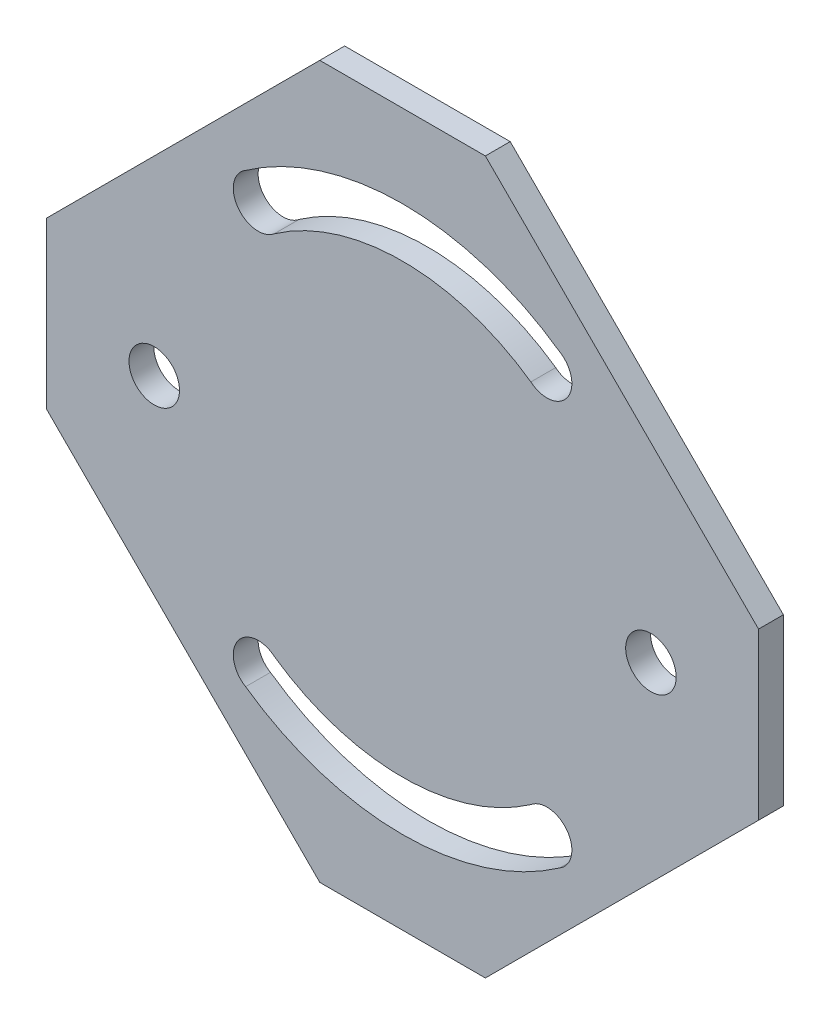
ISO-10303-21;
HEADER;
FILE_DESCRIPTION(('STEP AP214'),'2;1');
FILE_NAME('part.step','',(''),(''),'','','');
FILE_SCHEMA(('AUTOMOTIVE_DESIGN { 1 0 10303 214 1 1 1 1 }'));
ENDSEC;
DATA;
#1=APPLICATION_CONTEXT('core data for automotive mechanical design processes');
#2=APPLICATION_PROTOCOL_DEFINITION('international standard','automotive_design',2000,#1);
#3=PRODUCT_CONTEXT('',#1,'mechanical');
#4=PRODUCT('Part','Part','',(#3));
#5=PRODUCT_RELATED_PRODUCT_CATEGORY('part','',(#4));
#6=PRODUCT_DEFINITION_FORMATION('','',#4);
#7=PRODUCT_DEFINITION_CONTEXT('part definition',#1,'design');
#8=PRODUCT_DEFINITION('design','',#6,#7);
#9=PRODUCT_DEFINITION_SHAPE('','',#8);
#10=(LENGTH_UNIT() NAMED_UNIT(*) SI_UNIT(.MILLI.,.METRE.));
#11=(NAMED_UNIT(*) PLANE_ANGLE_UNIT() SI_UNIT($,.RADIAN.));
#12=(NAMED_UNIT(*) SI_UNIT($,.STERADIAN.) SOLID_ANGLE_UNIT());
#13=UNCERTAINTY_MEASURE_WITH_UNIT(LENGTH_MEASURE(1.E-05),#10,'distance_accuracy_value','');
#14=(GEOMETRIC_REPRESENTATION_CONTEXT(3) GLOBAL_UNCERTAINTY_ASSIGNED_CONTEXT((#13)) GLOBAL_UNIT_ASSIGNED_CONTEXT((#10,
#11,#12)) REPRESENTATION_CONTEXT('',''));
#15=CARTESIAN_POINT('',(0.,0.,0.));
#16=DIRECTION('',(0.,0.,1.));
#17=DIRECTION('',(1.,0.,0.));
#18=AXIS2_PLACEMENT_3D('',#15,#16,#17);
#19=CARTESIAN_POINT('',(53.0388822873707,-0.445460797800119,3.));
#20=DIRECTION('',(0.,0.,-1.));
#21=DIRECTION('',(-1.,0.,0.));
#22=AXIS2_PLACEMENT_3D('',#19,#20,#21);
#23=PLANE('',#22);
#24=CARTESIAN_POINT('',(-29.9597897126299,-0.445460797799391,3.));
#25=DIRECTION('',(0.,0.,1.));
#26=DIRECTION('',(1.,0.,0.));
#27=AXIS2_PLACEMENT_3D('',#24,#25,#26);
#28=CIRCLE('',#27,3.04995119999996);
#29=CARTESIAN_POINT('',(-26.90983851263,-0.445460797799391,3.));
#30=VERTEX_POINT('',#29);
#31=EDGE_CURVE('E180',#30,#30,#28,.T.);
#32=ORIENTED_EDGE('',*,*,#31,.F.);
#33=EDGE_LOOP('',(#32));
#34=FACE_BOUND('',#33,.T.);
#35=CARTESIAN_POINT('',(17.4791359353753,23.9643390963976,3.));
#36=DIRECTION('',(0.,0.,1.));
#37=DIRECTION('',(1.,0.,0.));
#38=AXIS2_PLACEMENT_3D('',#35,#36,#37);
#39=CIRCLE('',#38,3.01086531020103);
#40=CARTESIAN_POINT('',(15.5368574720019,21.6637165095998,3.));
#41=VERTEX_POINT('',#40);
#42=CARTESIAN_POINT('',(19.003872379796,26.5605842102554,3.));
#43=VERTEX_POINT('',#42);
#44=EDGE_CURVE('E192',#41,#43,#39,.T.);
#45=ORIENTED_EDGE('',*,*,#44,.F.);
#46=CARTESIAN_POINT('',(0.0397302873712535,-0.445460797799391,3.));
#47=DIRECTION('',(0.,0.,-1.));
#48=DIRECTION('',(1.,0.,0.));
#49=AXIS2_PLACEMENT_3D('',#46,#47,#48);
#50=CIRCLE('',#49,26.9995680000002);
#51=CARTESIAN_POINT('',(-15.4573968972606,21.663716509599,3.));
#52=VERTEX_POINT('',#51);
#53=EDGE_CURVE('E200',#52,#41,#50,.T.);
#54=ORIENTED_EDGE('',*,*,#53,.F.);
#55=CARTESIAN_POINT('',(-17.3996753606285,23.9643390964011,3.));
#56=DIRECTION('',(0.,0.,1.));
#57=DIRECTION('',(1.,0.,0.));
#58=AXIS2_PLACEMENT_3D('',#55,#56,#57);
#59=CIRCLE('',#58,3.01086531020042);
#60=CARTESIAN_POINT('',(-18.9244118050535,26.5605842102554,3.));
#61=VERTEX_POINT('',#60);
#62=EDGE_CURVE('E197',#61,#52,#59,.T.);
#63=ORIENTED_EDGE('',*,*,#62,.F.);
#64=CARTESIAN_POINT('',(0.0397302873712535,-0.445460797799391,3.));
#65=DIRECTION('',(0.,0.,1.));
#66=DIRECTION('',(1.,0.,0.));
#67=AXIS2_PLACEMENT_3D('',#64,#65,#66);
#68=CIRCLE('',#67,32.9994719999996);
#69=EDGE_CURVE('E194',#43,#61,#68,.T.);
#70=ORIENTED_EDGE('',*,*,#69,.F.);
#71=EDGE_LOOP('',(#45,#54,#63,#70));
#72=FACE_BOUND('',#71,.T.);
#73=DIRECTION('',(0.707106781186547,0.707106781186547,0.));
#74=VECTOR('',#73,1.);
#75=CARTESIAN_POINT('',(10.0395702873696,-43.4447727978012,3.));
#76=LINE('',#75,#74);
#77=CARTESIAN_POINT('',(10.0395702873696,-43.4447727978012,3.));
#78=VERTEX_POINT('',#77);
#79=CARTESIAN_POINT('',(43.0390422873678,-10.445300797803,3.));
#80=VERTEX_POINT('',#79);
#81=EDGE_CURVE('E223',#78,#80,#76,.T.);
#82=ORIENTED_EDGE('',*,*,#81,.T.);
#83=DIRECTION('',(0.,1.,0.));
#84=VECTOR('',#83,1.);
#85=CARTESIAN_POINT('',(43.0390422873678,-10.445300797803,3.));
#86=LINE('',#85,#84);
#87=CARTESIAN_POINT('',(43.0390422873665,9.55437920220403,3.));
#88=VERTEX_POINT('',#87);
#89=EDGE_CURVE('E226',#80,#88,#86,.T.);
#90=ORIENTED_EDGE('',*,*,#89,.T.);
#91=DIRECTION('',(-0.707106781186548,0.707106781186548,0.));
#92=VECTOR('',#91,1.);
#93=CARTESIAN_POINT('',(10.0395702873673,42.5538512022033,3.));
#94=LINE('',#93,#92);
#95=CARTESIAN_POINT('',(10.0395702873673,42.5538512022033,3.));
#96=VERTEX_POINT('',#95);
#97=EDGE_CURVE('E229',#88,#96,#94,.T.);
#98=ORIENTED_EDGE('',*,*,#97,.T.);
#99=DIRECTION('',(-1.,0.,0.));
#100=VECTOR('',#99,1.);
#101=CARTESIAN_POINT('',(10.0395702873673,42.5538512022033,3.));
#102=LINE('',#101,#100);
#103=CARTESIAN_POINT('',(-9.96010971262989,42.5538512022033,3.));
#104=VERTEX_POINT('',#103);
#105=EDGE_CURVE('E231',#96,#104,#102,.T.);
#106=ORIENTED_EDGE('',*,*,#105,.T.);
#107=DIRECTION('',(-0.707106781186548,-0.707106781186548,0.));
#108=VECTOR('',#107,1.);
#109=CARTESIAN_POINT('',(-9.96010971262989,42.5538512022033,3.));
#110=LINE('',#109,#108);
#111=CARTESIAN_POINT('',(-42.9595817126275,9.5543792022057,3.));
#112=VERTEX_POINT('',#111);
#113=EDGE_CURVE('E233',#104,#112,#110,.T.);
#114=ORIENTED_EDGE('',*,*,#113,.T.);
#115=DIRECTION('',(0.,-1.,0.));
#116=VECTOR('',#115,1.);
#117=CARTESIAN_POINT('',(-42.9595817126275,-10.445300797803,3.));
#118=LINE('',#117,#116);
#119=CARTESIAN_POINT('',(-42.9595817126275,-10.445300797803,3.));
#120=VERTEX_POINT('',#119);
#121=EDGE_CURVE('E235',#112,#120,#118,.T.);
#122=ORIENTED_EDGE('',*,*,#121,.T.);
#123=DIRECTION('',(0.707106781186548,-0.707106781186548,0.));
#124=VECTOR('',#123,1.);
#125=CARTESIAN_POINT('',(-9.96010971262934,-43.4447727978012,3.));
#126=LINE('',#125,#124);
#127=CARTESIAN_POINT('',(-9.96010971262934,-43.4447727978012,3.));
#128=VERTEX_POINT('',#127);
#129=EDGE_CURVE('E237',#120,#128,#126,.T.);
#130=ORIENTED_EDGE('',*,*,#129,.T.);
#131=DIRECTION('',(1.,0.,0.));
#132=VECTOR('',#131,1.);
#133=CARTESIAN_POINT('',(10.0395702873696,-43.4447727978012,3.));
#134=LINE('',#133,#132);
#135=EDGE_CURVE('E239',#128,#78,#134,.T.);
#136=ORIENTED_EDGE('',*,*,#135,.T.);
#137=EDGE_LOOP('',(#82,#90,#98,#106,#114,#122,#130,#136));
#138=FACE_BOUND('',#137,.T.);
#139=CARTESIAN_POINT('',(30.0392502873704,-0.445460797799391,3.));
#140=DIRECTION('',(0.,0.,1.));
#141=DIRECTION('',(1.,0.,0.));
#142=AXIS2_PLACEMENT_3D('',#139,#140,#141);
#143=CIRCLE('',#142,3.04995119999996);
#144=CARTESIAN_POINT('',(33.0892014873704,-0.445460797799391,3.));
#145=VERTEX_POINT('',#144);
#146=EDGE_CURVE('E186',#145,#145,#143,.T.);
#147=ORIENTED_EDGE('',*,*,#146,.F.);
#148=EDGE_LOOP('',(#147));
#149=FACE_BOUND('',#148,.T.);
#150=CARTESIAN_POINT('',(-17.399675360629,-24.8552606920005,3.));
#151=DIRECTION('',(0.,0.,1.));
#152=DIRECTION('',(1.,0.,0.));
#153=AXIS2_PLACEMENT_3D('',#150,#151,#152);
#154=CIRCLE('',#153,3.01086531020044);
#155=CARTESIAN_POINT('',(-15.4573968972609,-22.5546381051976,3.));
#156=VERTEX_POINT('',#155);
#157=CARTESIAN_POINT('',(-18.9244118050538,-27.4515058058545,3.));
#158=VERTEX_POINT('',#157);
#159=EDGE_CURVE('E144',#156,#158,#154,.T.);
#160=ORIENTED_EDGE('',*,*,#159,.F.);
#161=CARTESIAN_POINT('',(0.0397302873712535,-0.445460797799391,3.));
#162=DIRECTION('',(0.,0.,-1.));
#163=DIRECTION('',(1.,0.,0.));
#164=AXIS2_PLACEMENT_3D('',#161,#162,#163);
#165=CIRCLE('',#164,26.9995680000002);
#166=CARTESIAN_POINT('',(15.5368574720019,-22.5546381051986,3.));
#167=VERTEX_POINT('',#166);
#168=EDGE_CURVE('E166',#167,#156,#165,.T.);
#169=ORIENTED_EDGE('',*,*,#168,.F.);
#170=CARTESIAN_POINT('',(17.4791359353794,-24.8552606919944,3.));
#171=DIRECTION('',(0.,0.,1.));
#172=DIRECTION('',(1.,0.,0.));
#173=AXIS2_PLACEMENT_3D('',#170,#171,#172);
#174=CIRCLE('',#173,3.01086531020184);
#175=CARTESIAN_POINT('',(19.0038723797963,-27.4515058058545,3.));
#176=VERTEX_POINT('',#175);
#177=EDGE_CURVE('E164',#176,#167,#174,.T.);
#178=ORIENTED_EDGE('',*,*,#177,.F.);
#179=CARTESIAN_POINT('',(0.0397302873712535,-0.445460797799391,3.));
#180=DIRECTION('',(0.,0.,1.));
#181=DIRECTION('',(1.,0.,0.));
#182=AXIS2_PLACEMENT_3D('',#179,#180,#181);
#183=CIRCLE('',#182,32.999472);
#184=EDGE_CURVE('E152',#158,#176,#183,.T.);
#185=ORIENTED_EDGE('',*,*,#184,.F.);
#186=EDGE_LOOP('',(#160,#169,#178,#185));
#187=FACE_BOUND('',#186,.T.);
#188=ADVANCED_FACE('F31',(#34,#72,#138,#149,#187),#23,.F.);
#189=CARTESIAN_POINT('',(53.0388822873707,-0.445460797800119,0.));
#190=DIRECTION('',(0.,0.,-1.));
#191=DIRECTION('',(-1.,0.,0.));
#192=AXIS2_PLACEMENT_3D('',#189,#190,#191);
#193=PLANE('',#192);
#194=CARTESIAN_POINT('',(-29.9597897126299,-0.445460797799391,0.));
#195=DIRECTION('',(0.,0.,1.));
#196=DIRECTION('',(1.,0.,0.));
#197=AXIS2_PLACEMENT_3D('',#194,#195,#196);
#198=CIRCLE('',#197,3.04995119999996);
#199=CARTESIAN_POINT('',(-26.90983851263,-0.445460797799391,0.));
#200=VERTEX_POINT('',#199);
#201=EDGE_CURVE('E160',#200,#200,#198,.T.);
#202=ORIENTED_EDGE('',*,*,#201,.T.);
#203=EDGE_LOOP('',(#202));
#204=FACE_BOUND('',#203,.T.);
#205=CARTESIAN_POINT('',(0.0397302873712535,-0.445460797799391,0.));
#206=DIRECTION('',(0.,0.,-1.));
#207=DIRECTION('',(1.,0.,0.));
#208=AXIS2_PLACEMENT_3D('',#205,#206,#207);
#209=CIRCLE('',#208,26.9995680000002);
#210=CARTESIAN_POINT('',(-15.4573968972604,21.6637165095989,0.));
#211=VERTEX_POINT('',#210);
#212=CARTESIAN_POINT('',(15.5368574720019,21.6637165095998,0.));
#213=VERTEX_POINT('',#212);
#214=EDGE_CURVE('E195',#211,#213,#209,.T.);
#215=ORIENTED_EDGE('',*,*,#214,.T.);
#216=CARTESIAN_POINT('',(17.4791359353753,23.9643390963976,0.));
#217=DIRECTION('',(0.,0.,1.));
#218=DIRECTION('',(1.,0.,0.));
#219=AXIS2_PLACEMENT_3D('',#216,#217,#218);
#220=CIRCLE('',#219,3.01086531020103);
#221=CARTESIAN_POINT('',(19.003872379796,26.5605842102554,0.));
#222=VERTEX_POINT('',#221);
#223=EDGE_CURVE('E189',#213,#222,#220,.T.);
#224=ORIENTED_EDGE('',*,*,#223,.T.);
#225=CARTESIAN_POINT('',(0.0397302873712535,-0.445460797799391,0.));
#226=DIRECTION('',(0.,0.,1.));
#227=DIRECTION('',(1.,0.,0.));
#228=AXIS2_PLACEMENT_3D('',#225,#226,#227);
#229=CIRCLE('',#228,32.9994719999996);
#230=CARTESIAN_POINT('',(-18.9244118050535,26.5605842102554,0.));
#231=VERTEX_POINT('',#230);
#232=EDGE_CURVE('E205',#222,#231,#229,.T.);
#233=ORIENTED_EDGE('',*,*,#232,.T.);
#234=CARTESIAN_POINT('',(-17.3996753606285,23.9643390964011,0.));
#235=DIRECTION('',(0.,0.,1.));
#236=DIRECTION('',(1.,0.,0.));
#237=AXIS2_PLACEMENT_3D('',#234,#235,#236);
#238=CIRCLE('',#237,3.01086531020042);
#239=EDGE_CURVE('E208',#231,#211,#238,.T.);
#240=ORIENTED_EDGE('',*,*,#239,.T.);
#241=EDGE_LOOP('',(#215,#224,#233,#240));
#242=FACE_BOUND('',#241,.T.);
#243=DIRECTION('',(0.707106781186547,0.707106781186547,0.));
#244=VECTOR('',#243,1.);
#245=CARTESIAN_POINT('',(10.0395702873696,-43.4447727978012,0.));
#246=LINE('',#245,#244);
#247=CARTESIAN_POINT('',(10.0395702873696,-43.4447727978012,0.));
#248=VERTEX_POINT('',#247);
#249=CARTESIAN_POINT('',(43.0390422873678,-10.445300797803,0.));
#250=VERTEX_POINT('',#249);
#251=EDGE_CURVE('E222',#248,#250,#246,.T.);
#252=ORIENTED_EDGE('',*,*,#251,.F.);
#253=DIRECTION('',(1.,0.,0.));
#254=VECTOR('',#253,1.);
#255=CARTESIAN_POINT('',(10.0395702873696,-43.4447727978012,0.));
#256=LINE('',#255,#254);
#257=CARTESIAN_POINT('',(-9.96010971262934,-43.4447727978012,0.));
#258=VERTEX_POINT('',#257);
#259=EDGE_CURVE('E227',#258,#248,#256,.T.);
#260=ORIENTED_EDGE('',*,*,#259,.F.);
#261=DIRECTION('',(0.707106781186548,-0.707106781186548,0.));
#262=VECTOR('',#261,1.);
#263=CARTESIAN_POINT('',(-9.96010971262934,-43.4447727978012,0.));
#264=LINE('',#263,#262);
#265=CARTESIAN_POINT('',(-42.9595817126275,-10.445300797803,0.));
#266=VERTEX_POINT('',#265);
#267=EDGE_CURVE('E254',#266,#258,#264,.T.);
#268=ORIENTED_EDGE('',*,*,#267,.F.);
#269=DIRECTION('',(0.,-1.,0.));
#270=VECTOR('',#269,1.);
#271=CARTESIAN_POINT('',(-42.9595817126275,-10.445300797803,0.));
#272=LINE('',#271,#270);
#273=CARTESIAN_POINT('',(-42.9595817126275,9.5543792022057,0.));
#274=VERTEX_POINT('',#273);
#275=EDGE_CURVE('E252',#274,#266,#272,.T.);
#276=ORIENTED_EDGE('',*,*,#275,.F.);
#277=DIRECTION('',(-0.707106781186548,-0.707106781186548,0.));
#278=VECTOR('',#277,1.);
#279=CARTESIAN_POINT('',(-9.96010971262989,42.5538512022033,0.));
#280=LINE('',#279,#278);
#281=CARTESIAN_POINT('',(-9.96010971262989,42.5538512022033,0.));
#282=VERTEX_POINT('',#281);
#283=EDGE_CURVE('E250',#282,#274,#280,.T.);
#284=ORIENTED_EDGE('',*,*,#283,.F.);
#285=DIRECTION('',(-1.,0.,0.));
#286=VECTOR('',#285,1.);
#287=CARTESIAN_POINT('',(10.0395702873673,42.5538512022033,0.));
#288=LINE('',#287,#286);
#289=CARTESIAN_POINT('',(10.0395702873673,42.5538512022033,0.));
#290=VERTEX_POINT('',#289);
#291=EDGE_CURVE('E248',#290,#282,#288,.T.);
#292=ORIENTED_EDGE('',*,*,#291,.F.);
#293=DIRECTION('',(-0.707106781186548,0.707106781186548,0.));
#294=VECTOR('',#293,1.);
#295=CARTESIAN_POINT('',(10.0395702873673,42.5538512022033,0.));
#296=LINE('',#295,#294);
#297=CARTESIAN_POINT('',(43.0390422873665,9.55437920220403,0.));
#298=VERTEX_POINT('',#297);
#299=EDGE_CURVE('E246',#298,#290,#296,.T.);
#300=ORIENTED_EDGE('',*,*,#299,.F.);
#301=DIRECTION('',(0.,1.,0.));
#302=VECTOR('',#301,1.);
#303=CARTESIAN_POINT('',(43.0390422873678,-10.445300797803,0.));
#304=LINE('',#303,#302);
#305=EDGE_CURVE('E244',#250,#298,#304,.T.);
#306=ORIENTED_EDGE('',*,*,#305,.F.);
#307=EDGE_LOOP('',(#252,#260,#268,#276,#284,#292,#300,#306));
#308=FACE_BOUND('',#307,.T.);
#309=CARTESIAN_POINT('',(30.0392502873704,-0.445460797799391,0.));
#310=DIRECTION('',(0.,0.,1.));
#311=DIRECTION('',(1.,0.,0.));
#312=AXIS2_PLACEMENT_3D('',#309,#310,#311);
#313=CIRCLE('',#312,3.04995119999996);
#314=CARTESIAN_POINT('',(33.0892014873704,-0.445460797799391,0.));
#315=VERTEX_POINT('',#314);
#316=EDGE_CURVE('E183',#315,#315,#313,.T.);
#317=ORIENTED_EDGE('',*,*,#316,.T.);
#318=EDGE_LOOP('',(#317));
#319=FACE_BOUND('',#318,.T.);
#320=CARTESIAN_POINT('',(0.0397302873712535,-0.445460797799391,0.));
#321=DIRECTION('',(0.,0.,-1.));
#322=DIRECTION('',(1.,0.,0.));
#323=AXIS2_PLACEMENT_3D('',#320,#321,#322);
#324=CIRCLE('',#323,26.9995680000002);
#325=CARTESIAN_POINT('',(15.5368574720017,-22.5546381051983,0.));
#326=VERTEX_POINT('',#325);
#327=CARTESIAN_POINT('',(-15.4573968972609,-22.5546381051976,0.));
#328=VERTEX_POINT('',#327);
#329=EDGE_CURVE('E153',#326,#328,#324,.T.);
#330=ORIENTED_EDGE('',*,*,#329,.T.);
#331=CARTESIAN_POINT('',(-17.399675360629,-24.8552606920005,0.));
#332=DIRECTION('',(0.,0.,1.));
#333=DIRECTION('',(1.,0.,0.));
#334=AXIS2_PLACEMENT_3D('',#331,#332,#333);
#335=CIRCLE('',#334,3.01086531020044);
#336=CARTESIAN_POINT('',(-18.9244118050538,-27.4515058058545,0.));
#337=VERTEX_POINT('',#336);
#338=EDGE_CURVE('E54',#328,#337,#335,.T.);
#339=ORIENTED_EDGE('',*,*,#338,.T.);
#340=CARTESIAN_POINT('',(0.0397302873712535,-0.445460797799391,0.));
#341=DIRECTION('',(0.,0.,1.));
#342=DIRECTION('',(1.,0.,0.));
#343=AXIS2_PLACEMENT_3D('',#340,#341,#342);
#344=CIRCLE('',#343,32.999472);
#345=CARTESIAN_POINT('',(19.0038723797963,-27.4515058058545,0.));
#346=VERTEX_POINT('',#345);
#347=EDGE_CURVE('E159',#337,#346,#344,.T.);
#348=ORIENTED_EDGE('',*,*,#347,.T.);
#349=CARTESIAN_POINT('',(17.4791359353794,-24.8552606919944,0.));
#350=DIRECTION('',(0.,0.,1.));
#351=DIRECTION('',(1.,0.,0.));
#352=AXIS2_PLACEMENT_3D('',#349,#350,#351);
#353=CIRCLE('',#352,3.01086531020184);
#354=EDGE_CURVE('E172',#346,#326,#353,.T.);
#355=ORIENTED_EDGE('',*,*,#354,.T.);
#356=EDGE_LOOP('',(#330,#339,#348,#355));
#357=FACE_BOUND('',#356,.T.);
#358=ADVANCED_FACE('F284',(#204,#242,#308,#319,#357),#193,.T.);
#359=CARTESIAN_POINT('',(10.0395702873696,-43.4447727978012,3.));
#360=DIRECTION('',(-0.707106781186548,0.707106781186548,0.));
#361=DIRECTION('',(-0.707106781186548,-0.707106781186548,0.));
#362=AXIS2_PLACEMENT_3D('',#359,#360,#361);
#363=PLANE('',#362);
#364=ORIENTED_EDGE('',*,*,#251,.T.);
#365=DIRECTION('',(0.,0.,-1.));
#366=VECTOR('',#365,1.);
#367=CARTESIAN_POINT('',(43.0390422873678,-10.445300797803,3.));
#368=LINE('',#367,#366);
#369=EDGE_CURVE('E11',#80,#250,#368,.T.);
#370=ORIENTED_EDGE('',*,*,#369,.F.);
#371=ORIENTED_EDGE('',*,*,#81,.F.);
#372=DIRECTION('',(0.,0.,-1.));
#373=VECTOR('',#372,1.);
#374=CARTESIAN_POINT('',(10.0395702873696,-43.4447727978012,3.));
#375=LINE('',#374,#373);
#376=EDGE_CURVE('E241',#78,#248,#375,.T.);
#377=ORIENTED_EDGE('',*,*,#376,.T.);
#378=EDGE_LOOP('',(#364,#370,#371,#377));
#379=FACE_BOUND('',#378,.T.);
#380=ADVANCED_FACE('F33',(#379),#363,.F.);
#381=CARTESIAN_POINT('',(43.0390422873678,-10.445300797803,3.));
#382=DIRECTION('',(-1.,0.,0.));
#383=DIRECTION('',(0.,-1.,0.));
#384=AXIS2_PLACEMENT_3D('',#381,#382,#383);
#385=PLANE('',#384);
#386=ORIENTED_EDGE('',*,*,#305,.T.);
#387=DIRECTION('',(0.,0.,-1.));
#388=VECTOR('',#387,1.);
#389=CARTESIAN_POINT('',(43.0390422873665,9.55437920220403,3.));
#390=LINE('',#389,#388);
#391=EDGE_CURVE('E39',#88,#298,#390,.T.);
#392=ORIENTED_EDGE('',*,*,#391,.F.);
#393=ORIENTED_EDGE('',*,*,#89,.F.);
#394=ORIENTED_EDGE('',*,*,#369,.T.);
#395=EDGE_LOOP('',(#386,#392,#393,#394));
#396=FACE_BOUND('',#395,.T.);
#397=ADVANCED_FACE('F302',(#396),#385,.F.);
#398=CARTESIAN_POINT('',(10.0395702873673,42.5538512022033,3.));
#399=DIRECTION('',(-0.707106781186547,-0.707106781186547,0.));
#400=DIRECTION('',(0.707106781186548,-0.707106781186548,0.));
#401=AXIS2_PLACEMENT_3D('',#398,#399,#400);
#402=PLANE('',#401);
#403=ORIENTED_EDGE('',*,*,#299,.T.);
#404=DIRECTION('',(0.,0.,-1.));
#405=VECTOR('',#404,1.);
#406=CARTESIAN_POINT('',(10.0395702873673,42.5538512022033,3.));
#407=LINE('',#406,#405);
#408=EDGE_CURVE('E271',#96,#290,#407,.T.);
#409=ORIENTED_EDGE('',*,*,#408,.F.);
#410=ORIENTED_EDGE('',*,*,#97,.F.);
#411=ORIENTED_EDGE('',*,*,#391,.T.);
#412=EDGE_LOOP('',(#403,#409,#410,#411));
#413=FACE_BOUND('',#412,.T.);
#414=ADVANCED_FACE('F278',(#413),#402,.F.);
#415=CARTESIAN_POINT('',(10.0395702873673,42.5538512022033,3.));
#416=DIRECTION('',(0.,-1.,0.));
#417=DIRECTION('',(0.,0.,-1.));
#418=AXIS2_PLACEMENT_3D('',#415,#416,#417);
#419=PLANE('',#418);
#420=ORIENTED_EDGE('',*,*,#291,.T.);
#421=DIRECTION('',(0.,0.,-1.));
#422=VECTOR('',#421,1.);
#423=CARTESIAN_POINT('',(-9.96010971262989,42.5538512022033,3.));
#424=LINE('',#423,#422);
#425=EDGE_CURVE('E268',#104,#282,#424,.T.);
#426=ORIENTED_EDGE('',*,*,#425,.F.);
#427=ORIENTED_EDGE('',*,*,#105,.F.);
#428=ORIENTED_EDGE('',*,*,#408,.T.);
#429=EDGE_LOOP('',(#420,#426,#427,#428));
#430=FACE_BOUND('',#429,.T.);
#431=ADVANCED_FACE('F290',(#430),#419,.F.);
#432=CARTESIAN_POINT('',(-9.96010971262989,42.5538512022033,3.));
#433=DIRECTION('',(0.707106781186547,-0.707106781186547,0.));
#434=DIRECTION('',(0.707106781186548,0.707106781186548,0.));
#435=AXIS2_PLACEMENT_3D('',#432,#433,#434);
#436=PLANE('',#435);
#437=ORIENTED_EDGE('',*,*,#283,.T.);
#438=DIRECTION('',(0.,0.,-1.));
#439=VECTOR('',#438,1.);
#440=CARTESIAN_POINT('',(-42.9595817126275,9.5543792022057,3.));
#441=LINE('',#440,#439);
#442=EDGE_CURVE('E265',#112,#274,#441,.T.);
#443=ORIENTED_EDGE('',*,*,#442,.F.);
#444=ORIENTED_EDGE('',*,*,#113,.F.);
#445=ORIENTED_EDGE('',*,*,#425,.T.);
#446=EDGE_LOOP('',(#437,#443,#444,#445));
#447=FACE_BOUND('',#446,.T.);
#448=ADVANCED_FACE('F294',(#447),#436,.F.);
#449=CARTESIAN_POINT('',(-42.9595817126275,-10.445300797803,3.));
#450=DIRECTION('',(1.,0.,0.));
#451=DIRECTION('',(0.,0.,-1.));
#452=AXIS2_PLACEMENT_3D('',#449,#450,#451);
#453=PLANE('',#452);
#454=ORIENTED_EDGE('',*,*,#275,.T.);
#455=DIRECTION('',(0.,0.,-1.));
#456=VECTOR('',#455,1.);
#457=CARTESIAN_POINT('',(-42.9595817126275,-10.445300797803,3.));
#458=LINE('',#457,#456);
#459=EDGE_CURVE('E262',#120,#266,#458,.T.);
#460=ORIENTED_EDGE('',*,*,#459,.F.);
#461=ORIENTED_EDGE('',*,*,#121,.F.);
#462=ORIENTED_EDGE('',*,*,#442,.T.);
#463=EDGE_LOOP('',(#454,#460,#461,#462));
#464=FACE_BOUND('',#463,.T.);
#465=ADVANCED_FACE('F315',(#464),#453,.F.);
#466=CARTESIAN_POINT('',(-9.96010971262934,-43.4447727978012,3.));
#467=DIRECTION('',(0.707106781186547,0.707106781186547,0.));
#468=DIRECTION('',(-0.707106781186548,0.707106781186548,0.));
#469=AXIS2_PLACEMENT_3D('',#466,#467,#468);
#470=PLANE('',#469);
#471=ORIENTED_EDGE('',*,*,#267,.T.);
#472=DIRECTION('',(0.,0.,-1.));
#473=VECTOR('',#472,1.);
#474=CARTESIAN_POINT('',(-9.96010971262934,-43.4447727978012,3.));
#475=LINE('',#474,#473);
#476=EDGE_CURVE('E259',#128,#258,#475,.T.);
#477=ORIENTED_EDGE('',*,*,#476,.F.);
#478=ORIENTED_EDGE('',*,*,#129,.F.);
#479=ORIENTED_EDGE('',*,*,#459,.T.);
#480=EDGE_LOOP('',(#471,#477,#478,#479));
#481=FACE_BOUND('',#480,.T.);
#482=ADVANCED_FACE('F313',(#481),#470,.F.);
#483=CARTESIAN_POINT('',(10.0395702873696,-43.4447727978012,3.));
#484=DIRECTION('',(0.,1.,0.));
#485=DIRECTION('',(0.,0.,1.));
#486=AXIS2_PLACEMENT_3D('',#483,#484,#485);
#487=PLANE('',#486);
#488=ORIENTED_EDGE('',*,*,#259,.T.);
#489=ORIENTED_EDGE('',*,*,#376,.F.);
#490=ORIENTED_EDGE('',*,*,#135,.F.);
#491=ORIENTED_EDGE('',*,*,#476,.T.);
#492=EDGE_LOOP('',(#488,#489,#490,#491));
#493=FACE_BOUND('',#492,.T.);
#494=ADVANCED_FACE('F308',(#493),#487,.F.);
#495=CARTESIAN_POINT('',(17.4791359353753,23.9643390963976,3.));
#496=DIRECTION('',(0.,0.,-1.));
#497=DIRECTION('',(-1.,0.,0.));
#498=AXIS2_PLACEMENT_3D('',#495,#496,#497);
#499=CYLINDRICAL_SURFACE('',#498,3.01086531020103);
#500=ORIENTED_EDGE('',*,*,#223,.F.);
#501=DIRECTION('',(0.,0.,-1.));
#502=VECTOR('',#501,1.);
#503=CARTESIAN_POINT('',(15.5368574720019,21.6637165095998,3.));
#504=LINE('',#503,#502);
#505=EDGE_CURVE('E202',#41,#213,#504,.T.);
#506=ORIENTED_EDGE('',*,*,#505,.F.);
#507=ORIENTED_EDGE('',*,*,#44,.T.);
#508=DIRECTION('',(0.,0.,-1.));
#509=VECTOR('',#508,1.);
#510=CARTESIAN_POINT('',(19.003872379796,26.5605842102554,3.));
#511=LINE('',#510,#509);
#512=EDGE_CURVE('E219',#43,#222,#511,.T.);
#513=ORIENTED_EDGE('',*,*,#512,.T.);
#514=EDGE_LOOP('',(#500,#506,#507,#513));
#515=FACE_BOUND('',#514,.T.);
#516=ADVANCED_FACE('F335',(#515),#499,.F.);
#517=CARTESIAN_POINT('',(0.0397302873712535,-0.445460797799391,3.));
#518=DIRECTION('',(0.,0.,-1.));
#519=DIRECTION('',(-1.,0.,0.));
#520=AXIS2_PLACEMENT_3D('',#517,#518,#519);
#521=CYLINDRICAL_SURFACE('',#520,32.9994719999996);
#522=ORIENTED_EDGE('',*,*,#232,.F.);
#523=ORIENTED_EDGE('',*,*,#512,.F.);
#524=ORIENTED_EDGE('',*,*,#69,.T.);
#525=DIRECTION('',(0.,0.,-1.));
#526=VECTOR('',#525,1.);
#527=CARTESIAN_POINT('',(-18.9244118050535,26.5605842102554,3.));
#528=LINE('',#527,#526);
#529=EDGE_CURVE('E217',#61,#231,#528,.T.);
#530=ORIENTED_EDGE('',*,*,#529,.T.);
#531=EDGE_LOOP('',(#522,#523,#524,#530));
#532=FACE_BOUND('',#531,.T.);
#533=ADVANCED_FACE('F342',(#532),#521,.F.);
#534=CARTESIAN_POINT('',(-17.3996753606285,23.9643390964011,3.));
#535=DIRECTION('',(0.,0.,-1.));
#536=DIRECTION('',(-1.,0.,0.));
#537=AXIS2_PLACEMENT_3D('',#534,#535,#536);
#538=CYLINDRICAL_SURFACE('',#537,3.01086531020042);
#539=ORIENTED_EDGE('',*,*,#239,.F.);
#540=ORIENTED_EDGE('',*,*,#529,.F.);
#541=ORIENTED_EDGE('',*,*,#62,.T.);
#542=DIRECTION('',(0.,0.,-1.));
#543=VECTOR('',#542,1.);
#544=CARTESIAN_POINT('',(-15.4573968972604,21.6637165095989,3.));
#545=LINE('',#544,#543);
#546=EDGE_CURVE('E215',#52,#211,#545,.T.);
#547=ORIENTED_EDGE('',*,*,#546,.T.);
#548=EDGE_LOOP('',(#539,#540,#541,#547));
#549=FACE_BOUND('',#548,.T.);
#550=ADVANCED_FACE('F347',(#549),#538,.F.);
#551=CARTESIAN_POINT('',(0.0397302873712535,-0.445460797799391,3.));
#552=DIRECTION('',(0.,0.,-1.));
#553=DIRECTION('',(-1.,0.,0.));
#554=AXIS2_PLACEMENT_3D('',#551,#552,#553);
#555=CYLINDRICAL_SURFACE('',#554,26.9995680000002);
#556=ORIENTED_EDGE('',*,*,#214,.F.);
#557=ORIENTED_EDGE('',*,*,#546,.F.);
#558=ORIENTED_EDGE('',*,*,#53,.T.);
#559=ORIENTED_EDGE('',*,*,#505,.T.);
#560=EDGE_LOOP('',(#556,#557,#558,#559));
#561=FACE_BOUND('',#560,.T.);
#562=ADVANCED_FACE('F355',(#561),#555,.T.);
#563=CARTESIAN_POINT('',(30.0392502873704,-0.445460797799391,3.));
#564=DIRECTION('',(0.,0.,-1.));
#565=DIRECTION('',(-1.,0.,0.));
#566=AXIS2_PLACEMENT_3D('',#563,#564,#565);
#567=CYLINDRICAL_SURFACE('',#566,3.04995119999996);
#568=ORIENTED_EDGE('',*,*,#146,.T.);
#569=EDGE_LOOP('',(#568));
#570=FACE_BOUND('',#569,.T.);
#571=ORIENTED_EDGE('',*,*,#316,.F.);
#572=EDGE_LOOP('',(#571));
#573=FACE_BOUND('',#572,.T.);
#574=ADVANCED_FACE('F367',(#570,#573),#567,.F.);
#575=CARTESIAN_POINT('',(-29.9597897126299,-0.445460797799391,3.));
#576=DIRECTION('',(0.,0.,-1.));
#577=DIRECTION('',(-1.,0.,0.));
#578=AXIS2_PLACEMENT_3D('',#575,#576,#577);
#579=CYLINDRICAL_SURFACE('',#578,3.04995119999996);
#580=ORIENTED_EDGE('',*,*,#31,.T.);
#581=EDGE_LOOP('',(#580));
#582=FACE_BOUND('',#581,.T.);
#583=ORIENTED_EDGE('',*,*,#201,.F.);
#584=EDGE_LOOP('',(#583));
#585=FACE_BOUND('',#584,.T.);
#586=ADVANCED_FACE('F372',(#582,#585),#579,.F.);
#587=CARTESIAN_POINT('',(-17.399675360629,-24.8552606920005,3.));
#588=DIRECTION('',(0.,0.,-1.));
#589=DIRECTION('',(-1.,0.,0.));
#590=AXIS2_PLACEMENT_3D('',#587,#588,#589);
#591=CYLINDRICAL_SURFACE('',#590,3.01086531020044);
#592=ORIENTED_EDGE('',*,*,#338,.F.);
#593=DIRECTION('',(0.,0.,-1.));
#594=VECTOR('',#593,1.);
#595=CARTESIAN_POINT('',(-15.4573968972609,-22.5546381051976,3.));
#596=LINE('',#595,#594);
#597=EDGE_CURVE('E148',#156,#328,#596,.T.);
#598=ORIENTED_EDGE('',*,*,#597,.F.);
#599=ORIENTED_EDGE('',*,*,#159,.T.);
#600=DIRECTION('',(0.,0.,-1.));
#601=VECTOR('',#600,1.);
#602=CARTESIAN_POINT('',(-18.9244118050538,-27.4515058058545,3.));
#603=LINE('',#602,#601);
#604=EDGE_CURVE('E147',#158,#337,#603,.T.);
#605=ORIENTED_EDGE('',*,*,#604,.T.);
#606=EDGE_LOOP('',(#592,#598,#599,#605));
#607=FACE_BOUND('',#606,.T.);
#608=ADVANCED_FACE('F146',(#607),#591,.F.);
#609=CARTESIAN_POINT('',(0.0397302873712535,-0.445460797799391,3.));
#610=DIRECTION('',(0.,0.,-1.));
#611=DIRECTION('',(-1.,0.,0.));
#612=AXIS2_PLACEMENT_3D('',#609,#610,#611);
#613=CYLINDRICAL_SURFACE('',#612,32.999472);
#614=ORIENTED_EDGE('',*,*,#347,.F.);
#615=ORIENTED_EDGE('',*,*,#604,.F.);
#616=ORIENTED_EDGE('',*,*,#184,.T.);
#617=DIRECTION('',(0.,0.,-1.));
#618=VECTOR('',#617,1.);
#619=CARTESIAN_POINT('',(19.0038723797963,-27.4515058058545,3.));
#620=LINE('',#619,#618);
#621=EDGE_CURVE('E161',#176,#346,#620,.T.);
#622=ORIENTED_EDGE('',*,*,#621,.T.);
#623=EDGE_LOOP('',(#614,#615,#616,#622));
#624=FACE_BOUND('',#623,.T.);
#625=ADVANCED_FACE('F156',(#624),#613,.F.);
#626=CARTESIAN_POINT('',(17.4791359353794,-24.8552606919944,3.));
#627=DIRECTION('',(0.,0.,-1.));
#628=DIRECTION('',(-1.,0.,0.));
#629=AXIS2_PLACEMENT_3D('',#626,#627,#628);
#630=CYLINDRICAL_SURFACE('',#629,3.01086531020184);
#631=ORIENTED_EDGE('',*,*,#354,.F.);
#632=ORIENTED_EDGE('',*,*,#621,.F.);
#633=ORIENTED_EDGE('',*,*,#177,.T.);
#634=DIRECTION('',(0.,0.,-1.));
#635=VECTOR('',#634,1.);
#636=CARTESIAN_POINT('',(15.5368574720017,-22.5546381051983,3.));
#637=LINE('',#636,#635);
#638=EDGE_CURVE('E46',#167,#326,#637,.T.);
#639=ORIENTED_EDGE('',*,*,#638,.T.);
#640=EDGE_LOOP('',(#631,#632,#633,#639));
#641=FACE_BOUND('',#640,.T.);
#642=ADVANCED_FACE('F381',(#641),#630,.F.);
#643=CARTESIAN_POINT('',(0.0397302873712535,-0.445460797799391,3.));
#644=DIRECTION('',(0.,0.,-1.));
#645=DIRECTION('',(-1.,0.,0.));
#646=AXIS2_PLACEMENT_3D('',#643,#644,#645);
#647=CYLINDRICAL_SURFACE('',#646,26.9995680000002);
#648=ORIENTED_EDGE('',*,*,#329,.F.);
#649=ORIENTED_EDGE('',*,*,#638,.F.);
#650=ORIENTED_EDGE('',*,*,#168,.T.);
#651=ORIENTED_EDGE('',*,*,#597,.T.);
#652=EDGE_LOOP('',(#648,#649,#650,#651));
#653=FACE_BOUND('',#652,.T.);
#654=ADVANCED_FACE('F384',(#653),#647,.T.);
#655=CLOSED_SHELL('',(#188,#358,#380,#397,#414,#431,#448,#465,#482,#494,#516,#533,#550,#562,
#574,#586,#608,#625,#642,#654));
#656=MANIFOLD_SOLID_BREP('B2',#655);
#657=ADVANCED_BREP_SHAPE_REPRESENTATION('',(#18,#656),#14);
#658=SHAPE_DEFINITION_REPRESENTATION(#9,#657);
ENDSEC;
END-ISO-10303-21;
